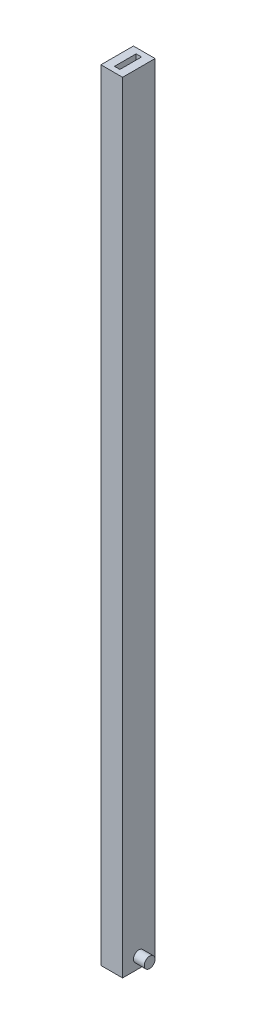
ISO-10303-21;
HEADER;
FILE_DESCRIPTION(('STEP AP214'),'2;1');
FILE_NAME('part.step','',(''),(''),'','','');
FILE_SCHEMA(('AUTOMOTIVE_DESIGN { 1 0 10303 214 1 1 1 1 }'));
ENDSEC;
DATA;
#1=APPLICATION_CONTEXT('core data for automotive mechanical design processes');
#2=APPLICATION_PROTOCOL_DEFINITION('international standard','automotive_design',2000,#1);
#3=PRODUCT_CONTEXT('',#1,'mechanical');
#4=PRODUCT('Part','Part','',(#3));
#5=PRODUCT_RELATED_PRODUCT_CATEGORY('part','',(#4));
#6=PRODUCT_DEFINITION_FORMATION('','',#4);
#7=PRODUCT_DEFINITION_CONTEXT('part definition',#1,'design');
#8=PRODUCT_DEFINITION('design','',#6,#7);
#9=PRODUCT_DEFINITION_SHAPE('','',#8);
#10=(LENGTH_UNIT() NAMED_UNIT(*) SI_UNIT(.MILLI.,.METRE.));
#11=(NAMED_UNIT(*) PLANE_ANGLE_UNIT() SI_UNIT($,.RADIAN.));
#12=(NAMED_UNIT(*) SI_UNIT($,.STERADIAN.) SOLID_ANGLE_UNIT());
#13=UNCERTAINTY_MEASURE_WITH_UNIT(LENGTH_MEASURE(1.E-05),#10,'distance_accuracy_value','');
#14=(GEOMETRIC_REPRESENTATION_CONTEXT(3) GLOBAL_UNCERTAINTY_ASSIGNED_CONTEXT((#13)) GLOBAL_UNIT_ASSIGNED_CONTEXT((#10,
#11,#12)) REPRESENTATION_CONTEXT('',''));
#15=CARTESIAN_POINT('',(0.,0.,0.));
#16=DIRECTION('',(0.,0.,1.));
#17=DIRECTION('',(1.,0.,0.));
#18=AXIS2_PLACEMENT_3D('',#15,#16,#17);
#19=CARTESIAN_POINT('',(0.,457.2,0.));
#20=DIRECTION('',(0.,-1.,0.));
#21=DIRECTION('',(0.,0.,-1.));
#22=AXIS2_PLACEMENT_3D('',#19,#20,#21);
#23=PLANE('',#22);
#24=DIRECTION('',(0.,0.,-1.));
#25=VECTOR('',#24,1.);
#26=CARTESIAN_POINT('',(6.35,457.2,9.525));
#27=LINE('',#26,#25);
#28=CARTESIAN_POINT('',(6.35,457.2,9.525));
#29=VERTEX_POINT('',#28);
#30=CARTESIAN_POINT('',(6.35,457.2,-9.525));
#31=VERTEX_POINT('',#30);
#32=EDGE_CURVE('E138',#29,#31,#27,.T.);
#33=ORIENTED_EDGE('',*,*,#32,.T.);
#34=DIRECTION('',(-1.,0.,0.));
#35=VECTOR('',#34,1.);
#36=CARTESIAN_POINT('',(-6.35,457.2,-9.525));
#37=LINE('',#36,#35);
#38=CARTESIAN_POINT('',(-6.35,457.2,-9.525));
#39=VERTEX_POINT('',#38);
#40=EDGE_CURVE('E141',#31,#39,#37,.T.);
#41=ORIENTED_EDGE('',*,*,#40,.T.);
#42=DIRECTION('',(0.,0.,1.));
#43=VECTOR('',#42,1.);
#44=CARTESIAN_POINT('',(-6.35,457.2,9.525));
#45=LINE('',#44,#43);
#46=CARTESIAN_POINT('',(-6.35,457.2,9.525));
#47=VERTEX_POINT('',#46);
#48=EDGE_CURVE('E144',#39,#47,#45,.T.);
#49=ORIENTED_EDGE('',*,*,#48,.T.);
#50=DIRECTION('',(1.,0.,0.));
#51=VECTOR('',#50,1.);
#52=CARTESIAN_POINT('',(-6.35,457.2,9.525));
#53=LINE('',#52,#51);
#54=EDGE_CURVE('E146',#47,#29,#53,.T.);
#55=ORIENTED_EDGE('',*,*,#54,.T.);
#56=EDGE_LOOP('',(#33,#41,#49,#55));
#57=FACE_BOUND('',#56,.T.);
#58=DIRECTION('',(0.,0.,-1.));
#59=VECTOR('',#58,1.);
#60=CARTESIAN_POINT('',(1.5875,457.2,6.35));
#61=LINE('',#60,#59);
#62=CARTESIAN_POINT('',(1.5875,457.2,6.35));
#63=VERTEX_POINT('',#62);
#64=CARTESIAN_POINT('',(1.5875,457.2,-6.35));
#65=VERTEX_POINT('',#64);
#66=EDGE_CURVE('E100',#63,#65,#61,.T.);
#67=ORIENTED_EDGE('',*,*,#66,.F.);
#68=DIRECTION('',(1.,0.,0.));
#69=VECTOR('',#68,1.);
#70=CARTESIAN_POINT('',(-1.5875,457.2,6.35));
#71=LINE('',#70,#69);
#72=CARTESIAN_POINT('',(-1.5875,457.2,6.35));
#73=VERTEX_POINT('',#72);
#74=EDGE_CURVE('E122',#73,#63,#71,.T.);
#75=ORIENTED_EDGE('',*,*,#74,.F.);
#76=DIRECTION('',(0.,0.,1.));
#77=VECTOR('',#76,1.);
#78=CARTESIAN_POINT('',(-1.5875,457.2,6.35));
#79=LINE('',#78,#77);
#80=CARTESIAN_POINT('',(-1.5875,457.2,-6.35));
#81=VERTEX_POINT('',#80);
#82=EDGE_CURVE('E120',#81,#73,#79,.T.);
#83=ORIENTED_EDGE('',*,*,#82,.F.);
#84=DIRECTION('',(-1.,0.,0.));
#85=VECTOR('',#84,1.);
#86=CARTESIAN_POINT('',(-1.5875,457.2,-6.35));
#87=LINE('',#86,#85);
#88=EDGE_CURVE('E108',#65,#81,#87,.T.);
#89=ORIENTED_EDGE('',*,*,#88,.F.);
#90=EDGE_LOOP('',(#67,#75,#83,#89));
#91=FACE_BOUND('',#90,.T.);
#92=ADVANCED_FACE('F35',(#57,#91),#23,.F.);
#93=CARTESIAN_POINT('',(0.,0.,0.));
#94=DIRECTION('',(0.,-1.,0.));
#95=DIRECTION('',(0.,0.,-1.));
#96=AXIS2_PLACEMENT_3D('',#93,#94,#95);
#97=PLANE('',#96);
#98=DIRECTION('',(0.,0.,-1.));
#99=VECTOR('',#98,1.);
#100=CARTESIAN_POINT('',(6.35,0.,9.525));
#101=LINE('',#100,#99);
#102=CARTESIAN_POINT('',(6.35,0.,9.525));
#103=VERTEX_POINT('',#102);
#104=CARTESIAN_POINT('',(6.35,0.,-9.525));
#105=VERTEX_POINT('',#104);
#106=EDGE_CURVE('E116',#103,#105,#101,.T.);
#107=ORIENTED_EDGE('',*,*,#106,.F.);
#108=DIRECTION('',(1.,0.,0.));
#109=VECTOR('',#108,1.);
#110=CARTESIAN_POINT('',(-6.35,0.,9.525));
#111=LINE('',#110,#109);
#112=CARTESIAN_POINT('',(-6.35,0.,9.525));
#113=VERTEX_POINT('',#112);
#114=EDGE_CURVE('E142',#113,#103,#111,.T.);
#115=ORIENTED_EDGE('',*,*,#114,.F.);
#116=DIRECTION('',(0.,0.,1.));
#117=VECTOR('',#116,1.);
#118=CARTESIAN_POINT('',(-6.35,0.,9.525));
#119=LINE('',#118,#117);
#120=CARTESIAN_POINT('',(-6.35,0.,-9.525));
#121=VERTEX_POINT('',#120);
#122=EDGE_CURVE('E153',#121,#113,#119,.T.);
#123=ORIENTED_EDGE('',*,*,#122,.F.);
#124=DIRECTION('',(-1.,0.,0.));
#125=VECTOR('',#124,1.);
#126=CARTESIAN_POINT('',(-6.35,0.,-9.525));
#127=LINE('',#126,#125);
#128=EDGE_CURVE('E151',#105,#121,#127,.T.);
#129=ORIENTED_EDGE('',*,*,#128,.F.);
#130=EDGE_LOOP('',(#107,#115,#123,#129));
#131=FACE_BOUND('',#130,.T.);
#132=DIRECTION('',(1.,0.,0.));
#133=VECTOR('',#132,1.);
#134=CARTESIAN_POINT('',(-1.5875,0.,6.35));
#135=LINE('',#134,#133);
#136=CARTESIAN_POINT('',(-1.5875,0.,6.35));
#137=VERTEX_POINT('',#136);
#138=CARTESIAN_POINT('',(1.5875,0.,6.35));
#139=VERTEX_POINT('',#138);
#140=EDGE_CURVE('E109',#137,#139,#135,.T.);
#141=ORIENTED_EDGE('',*,*,#140,.T.);
#142=DIRECTION('',(0.,0.,-1.));
#143=VECTOR('',#142,1.);
#144=CARTESIAN_POINT('',(1.5875,0.,6.35));
#145=LINE('',#144,#143);
#146=CARTESIAN_POINT('',(1.5875,0.,-6.35));
#147=VERTEX_POINT('',#146);
#148=EDGE_CURVE('E58',#139,#147,#145,.T.);
#149=ORIENTED_EDGE('',*,*,#148,.T.);
#150=DIRECTION('',(-1.,0.,0.));
#151=VECTOR('',#150,1.);
#152=CARTESIAN_POINT('',(-1.5875,0.,-6.35));
#153=LINE('',#152,#151);
#154=CARTESIAN_POINT('',(-1.5875,0.,-6.35));
#155=VERTEX_POINT('',#154);
#156=EDGE_CURVE('E115',#147,#155,#153,.T.);
#157=ORIENTED_EDGE('',*,*,#156,.T.);
#158=DIRECTION('',(0.,0.,1.));
#159=VECTOR('',#158,1.);
#160=CARTESIAN_POINT('',(-1.5875,0.,6.35));
#161=LINE('',#160,#159);
#162=EDGE_CURVE('E130',#155,#137,#161,.T.);
#163=ORIENTED_EDGE('',*,*,#162,.T.);
#164=EDGE_LOOP('',(#141,#149,#157,#163));
#165=FACE_BOUND('',#164,.T.);
#166=ADVANCED_FACE('F174',(#131,#165),#97,.T.);
#167=CARTESIAN_POINT('',(6.35,457.2,9.525));
#168=DIRECTION('',(-1.,0.,0.));
#169=DIRECTION('',(0.,0.,1.));
#170=AXIS2_PLACEMENT_3D('',#167,#168,#169);
#171=PLANE('',#170);
#172=CARTESIAN_POINT('',(6.35,6.35000000000002,0.));
#173=DIRECTION('',(-1.,0.,0.));
#174=DIRECTION('',(0.,0.,1.));
#175=AXIS2_PLACEMENT_3D('',#172,#173,#174);
#176=CIRCLE('',#175,3.175);
#177=CARTESIAN_POINT('',(6.35,6.35000000000002,3.175));
#178=VERTEX_POINT('',#177);
#179=EDGE_CURVE('E43',#178,#178,#176,.F.);
#180=ORIENTED_EDGE('',*,*,#179,.F.);
#181=EDGE_LOOP('',(#180));
#182=FACE_BOUND('',#181,.T.);
#183=ORIENTED_EDGE('',*,*,#106,.T.);
#184=DIRECTION('',(0.,-1.,0.));
#185=VECTOR('',#184,1.);
#186=CARTESIAN_POINT('',(6.35,457.2,-9.525));
#187=LINE('',#186,#185);
#188=EDGE_CURVE('E164',#31,#105,#187,.T.);
#189=ORIENTED_EDGE('',*,*,#188,.F.);
#190=ORIENTED_EDGE('',*,*,#32,.F.);
#191=DIRECTION('',(0.,-1.,0.));
#192=VECTOR('',#191,1.);
#193=CARTESIAN_POINT('',(6.35,457.2,9.525));
#194=LINE('',#193,#192);
#195=EDGE_CURVE('E148',#29,#103,#194,.T.);
#196=ORIENTED_EDGE('',*,*,#195,.T.);
#197=EDGE_LOOP('',(#183,#189,#190,#196));
#198=FACE_BOUND('',#197,.T.);
#199=ADVANCED_FACE('F37',(#182,#198),#171,.F.);
#200=CARTESIAN_POINT('',(-6.35,457.2,-9.525));
#201=DIRECTION('',(0.,0.,1.));
#202=DIRECTION('',(1.,0.,0.));
#203=AXIS2_PLACEMENT_3D('',#200,#201,#202);
#204=PLANE('',#203);
#205=ORIENTED_EDGE('',*,*,#128,.T.);
#206=DIRECTION('',(0.,-1.,0.));
#207=VECTOR('',#206,1.);
#208=CARTESIAN_POINT('',(-6.35,457.2,-9.525));
#209=LINE('',#208,#207);
#210=EDGE_CURVE('E161',#39,#121,#209,.T.);
#211=ORIENTED_EDGE('',*,*,#210,.F.);
#212=ORIENTED_EDGE('',*,*,#40,.F.);
#213=ORIENTED_EDGE('',*,*,#188,.T.);
#214=EDGE_LOOP('',(#205,#211,#212,#213));
#215=FACE_BOUND('',#214,.T.);
#216=ADVANCED_FACE('F173',(#215),#204,.F.);
#217=CARTESIAN_POINT('',(-6.35,457.2,9.525));
#218=DIRECTION('',(1.,0.,0.));
#219=DIRECTION('',(0.,0.,-1.));
#220=AXIS2_PLACEMENT_3D('',#217,#218,#219);
#221=PLANE('',#220);
#222=CARTESIAN_POINT('',(-6.35,6.35,0.));
#223=DIRECTION('',(1.,0.,0.));
#224=DIRECTION('',(0.,0.,-1.));
#225=AXIS2_PLACEMENT_3D('',#222,#223,#224);
#226=CIRCLE('',#225,3.175);
#227=CARTESIAN_POINT('',(-6.35,6.35,-3.175));
#228=VERTEX_POINT('',#227);
#229=EDGE_CURVE('E11',#228,#228,#226,.F.);
#230=ORIENTED_EDGE('',*,*,#229,.F.);
#231=EDGE_LOOP('',(#230));
#232=FACE_BOUND('',#231,.T.);
#233=ORIENTED_EDGE('',*,*,#122,.T.);
#234=DIRECTION('',(0.,-1.,0.));
#235=VECTOR('',#234,1.);
#236=CARTESIAN_POINT('',(-6.35,457.2,9.525));
#237=LINE('',#236,#235);
#238=EDGE_CURVE('E158',#47,#113,#237,.T.);
#239=ORIENTED_EDGE('',*,*,#238,.F.);
#240=ORIENTED_EDGE('',*,*,#48,.F.);
#241=ORIENTED_EDGE('',*,*,#210,.T.);
#242=EDGE_LOOP('',(#233,#239,#240,#241));
#243=FACE_BOUND('',#242,.T.);
#244=ADVANCED_FACE('F192',(#232,#243),#221,.F.);
#245=CARTESIAN_POINT('',(-6.35,457.2,9.525));
#246=DIRECTION('',(0.,0.,-1.));
#247=DIRECTION('',(-1.,0.,0.));
#248=AXIS2_PLACEMENT_3D('',#245,#246,#247);
#249=PLANE('',#248);
#250=ORIENTED_EDGE('',*,*,#114,.T.);
#251=ORIENTED_EDGE('',*,*,#195,.F.);
#252=ORIENTED_EDGE('',*,*,#54,.F.);
#253=ORIENTED_EDGE('',*,*,#238,.T.);
#254=EDGE_LOOP('',(#250,#251,#252,#253));
#255=FACE_BOUND('',#254,.T.);
#256=ADVANCED_FACE('F190',(#255),#249,.F.);
#257=CARTESIAN_POINT('',(1.5875,457.2,6.35));
#258=DIRECTION('',(-1.,0.,0.));
#259=DIRECTION('',(0.,0.,1.));
#260=AXIS2_PLACEMENT_3D('',#257,#258,#259);
#261=PLANE('',#260);
#262=CARTESIAN_POINT('',(1.58750000002783,450.85,0.));
#263=DIRECTION('',(-1.,0.,0.));
#264=DIRECTION('',(0.,0.,1.));
#265=AXIS2_PLACEMENT_3D('',#262,#263,#264);
#266=CIRCLE('',#265,3.175);
#267=CARTESIAN_POINT('',(1.58750000002783,450.85,3.175));
#268=VERTEX_POINT('',#267);
#269=EDGE_CURVE('E128',#268,#268,#266,.T.);
#270=ORIENTED_EDGE('',*,*,#269,.F.);
#271=EDGE_LOOP('',(#270));
#272=FACE_BOUND('',#271,.T.);
#273=ORIENTED_EDGE('',*,*,#148,.F.);
#274=DIRECTION('',(0.,-1.,0.));
#275=VECTOR('',#274,1.);
#276=CARTESIAN_POINT('',(1.5875,457.2,6.35));
#277=LINE('',#276,#275);
#278=EDGE_CURVE('E104',#63,#139,#277,.T.);
#279=ORIENTED_EDGE('',*,*,#278,.F.);
#280=ORIENTED_EDGE('',*,*,#66,.T.);
#281=DIRECTION('',(0.,-1.,0.));
#282=VECTOR('',#281,1.);
#283=CARTESIAN_POINT('',(1.5875,457.2,-6.35));
#284=LINE('',#283,#282);
#285=EDGE_CURVE('E103',#65,#147,#284,.T.);
#286=ORIENTED_EDGE('',*,*,#285,.T.);
#287=EDGE_LOOP('',(#273,#279,#280,#286));
#288=FACE_BOUND('',#287,.T.);
#289=ADVANCED_FACE('F102',(#272,#288),#261,.T.);
#290=CARTESIAN_POINT('',(-1.5875,457.2,-6.35));
#291=DIRECTION('',(0.,0.,1.));
#292=DIRECTION('',(1.,0.,0.));
#293=AXIS2_PLACEMENT_3D('',#290,#291,#292);
#294=PLANE('',#293);
#295=ORIENTED_EDGE('',*,*,#156,.F.);
#296=ORIENTED_EDGE('',*,*,#285,.F.);
#297=ORIENTED_EDGE('',*,*,#88,.T.);
#298=DIRECTION('',(0.,-1.,0.));
#299=VECTOR('',#298,1.);
#300=CARTESIAN_POINT('',(-1.5875,457.2,-6.35));
#301=LINE('',#300,#299);
#302=EDGE_CURVE('E117',#81,#155,#301,.T.);
#303=ORIENTED_EDGE('',*,*,#302,.T.);
#304=EDGE_LOOP('',(#295,#296,#297,#303));
#305=FACE_BOUND('',#304,.T.);
#306=ADVANCED_FACE('F112',(#305),#294,.T.);
#307=CARTESIAN_POINT('',(-1.5875,457.2,6.35));
#308=DIRECTION('',(1.,0.,0.));
#309=DIRECTION('',(0.,0.,-1.));
#310=AXIS2_PLACEMENT_3D('',#307,#308,#309);
#311=PLANE('',#310);
#312=CARTESIAN_POINT('',(-1.5875,450.85,0.));
#313=DIRECTION('',(1.,0.,0.));
#314=DIRECTION('',(0.,0.,-1.));
#315=AXIS2_PLACEMENT_3D('',#312,#313,#314);
#316=CIRCLE('',#315,3.175);
#317=CARTESIAN_POINT('',(-1.5875,450.85,-3.175));
#318=VERTEX_POINT('',#317);
#319=EDGE_CURVE('E249',#318,#318,#316,.T.);
#320=ORIENTED_EDGE('',*,*,#319,.F.);
#321=EDGE_LOOP('',(#320));
#322=FACE_BOUND('',#321,.T.);
#323=ORIENTED_EDGE('',*,*,#162,.F.);
#324=ORIENTED_EDGE('',*,*,#302,.F.);
#325=ORIENTED_EDGE('',*,*,#82,.T.);
#326=DIRECTION('',(0.,-1.,0.));
#327=VECTOR('',#326,1.);
#328=CARTESIAN_POINT('',(-1.5875,457.2,6.35));
#329=LINE('',#328,#327);
#330=EDGE_CURVE('E50',#73,#137,#329,.T.);
#331=ORIENTED_EDGE('',*,*,#330,.T.);
#332=EDGE_LOOP('',(#323,#324,#325,#331));
#333=FACE_BOUND('',#332,.T.);
#334=ADVANCED_FACE('F216',(#322,#333),#311,.T.);
#335=CARTESIAN_POINT('',(-1.5875,457.2,6.35));
#336=DIRECTION('',(0.,0.,-1.));
#337=DIRECTION('',(-1.,0.,0.));
#338=AXIS2_PLACEMENT_3D('',#335,#336,#337);
#339=PLANE('',#338);
#340=ORIENTED_EDGE('',*,*,#140,.F.);
#341=ORIENTED_EDGE('',*,*,#330,.F.);
#342=ORIENTED_EDGE('',*,*,#74,.T.);
#343=ORIENTED_EDGE('',*,*,#278,.T.);
#344=EDGE_LOOP('',(#340,#341,#342,#343));
#345=FACE_BOUND('',#344,.T.);
#346=ADVANCED_FACE('F219',(#345),#339,.T.);
#347=CARTESIAN_POINT('',(500000.,450.85,0.));
#348=DIRECTION('',(-1.,0.,0.));
#349=DIRECTION('',(0.,0.,1.));
#350=AXIS2_PLACEMENT_3D('',#347,#348,#349);
#351=CYLINDRICAL_SURFACE('',#350,3.175);
#352=ORIENTED_EDGE('',*,*,#269,.T.);
#353=EDGE_LOOP('',(#352));
#354=FACE_BOUND('',#353,.T.);
#355=ORIENTED_EDGE('',*,*,#319,.T.);
#356=EDGE_LOOP('',(#355));
#357=FACE_BOUND('',#356,.T.);
#358=ADVANCED_FACE('F223',(#354,#357),#351,.T.);
#359=CARTESIAN_POINT('',(12.7,6.35000000000002,0.));
#360=DIRECTION('',(-1.,0.,0.));
#361=DIRECTION('',(0.,0.,1.));
#362=AXIS2_PLACEMENT_3D('',#359,#360,#361);
#363=CYLINDRICAL_SURFACE('',#362,3.175);
#364=CARTESIAN_POINT('',(12.7,6.35000000000002,0.));
#365=DIRECTION('',(1.,0.,0.));
#366=DIRECTION('',(0.,0.,-1.));
#367=AXIS2_PLACEMENT_3D('',#364,#365,#366);
#368=CIRCLE('',#367,3.175);
#369=CARTESIAN_POINT('',(12.7,6.35000000000002,-3.175));
#370=VERTEX_POINT('',#369);
#371=EDGE_CURVE('E246',#370,#370,#368,.T.);
#372=ORIENTED_EDGE('',*,*,#371,.F.);
#373=EDGE_LOOP('',(#372));
#374=FACE_BOUND('',#373,.T.);
#375=ORIENTED_EDGE('',*,*,#179,.T.);
#376=EDGE_LOOP('',(#375));
#377=FACE_BOUND('',#376,.T.);
#378=ADVANCED_FACE('F169',(#374,#377),#363,.T.);
#379=CARTESIAN_POINT('',(12.7,6.35000000000002,0.));
#380=DIRECTION('',(1.,0.,0.));
#381=DIRECTION('',(0.,0.,-1.));
#382=AXIS2_PLACEMENT_3D('',#379,#380,#381);
#383=PLANE('',#382);
#384=ORIENTED_EDGE('',*,*,#371,.T.);
#385=EDGE_LOOP('',(#384));
#386=FACE_BOUND('',#385,.T.);
#387=ADVANCED_FACE('F229',(#386),#383,.T.);
#388=CARTESIAN_POINT('',(-12.7,6.35,0.));
#389=DIRECTION('',(1.,0.,0.));
#390=DIRECTION('',(0.,0.,-1.));
#391=AXIS2_PLACEMENT_3D('',#388,#389,#390);
#392=CYLINDRICAL_SURFACE('',#391,3.175);
#393=CARTESIAN_POINT('',(-12.7,6.35,0.));
#394=DIRECTION('',(-1.,0.,0.));
#395=DIRECTION('',(0.,0.,1.));
#396=AXIS2_PLACEMENT_3D('',#393,#394,#395);
#397=CIRCLE('',#396,3.175);
#398=CARTESIAN_POINT('',(-12.7,6.35,3.175));
#399=VERTEX_POINT('',#398);
#400=EDGE_CURVE('E245',#399,#399,#397,.T.);
#401=ORIENTED_EDGE('',*,*,#400,.F.);
#402=EDGE_LOOP('',(#401));
#403=FACE_BOUND('',#402,.T.);
#404=ORIENTED_EDGE('',*,*,#229,.T.);
#405=EDGE_LOOP('',(#404));
#406=FACE_BOUND('',#405,.T.);
#407=ADVANCED_FACE('F233',(#403,#406),#392,.T.);
#408=CARTESIAN_POINT('',(-12.7,6.35,0.));
#409=DIRECTION('',(-1.,0.,0.));
#410=DIRECTION('',(0.,0.,1.));
#411=AXIS2_PLACEMENT_3D('',#408,#409,#410);
#412=PLANE('',#411);
#413=ORIENTED_EDGE('',*,*,#400,.T.);
#414=EDGE_LOOP('',(#413));
#415=FACE_BOUND('',#414,.T.);
#416=ADVANCED_FACE('F237',(#415),#412,.T.);
#417=CLOSED_SHELL('',(#92,#166,#199,#216,#244,#256,#289,#306,#334,#346,#358,#378,#387,#407,#416));
#418=MANIFOLD_SOLID_BREP('B2',#417);
#419=ADVANCED_BREP_SHAPE_REPRESENTATION('',(#18,#418),#14);
#420=SHAPE_DEFINITION_REPRESENTATION(#9,#419);
ENDSEC;
END-ISO-10303-21;
